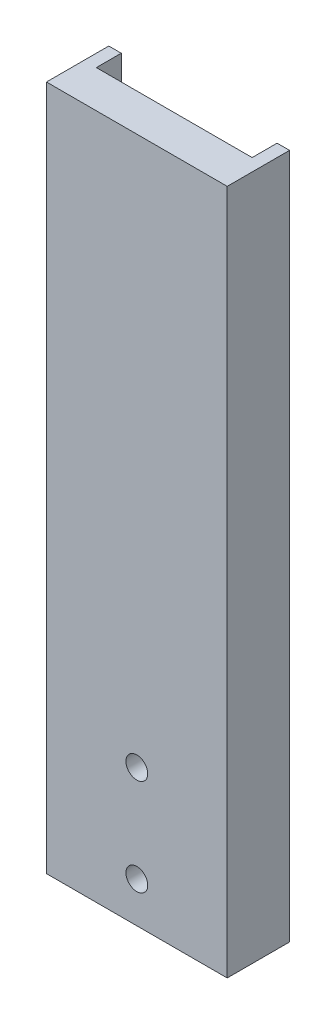
ISO-10303-21;
HEADER;
FILE_DESCRIPTION(('STEP AP214'),'2;1');
FILE_NAME('part.step','',(''),(''),'','','');
FILE_SCHEMA(('AUTOMOTIVE_DESIGN { 1 0 10303 214 1 1 1 1 }'));
ENDSEC;
DATA;
#1=APPLICATION_CONTEXT('core data for automotive mechanical design processes');
#2=APPLICATION_PROTOCOL_DEFINITION('international standard','automotive_design',2000,#1);
#3=PRODUCT_CONTEXT('',#1,'mechanical');
#4=PRODUCT('Part','Part','',(#3));
#5=PRODUCT_RELATED_PRODUCT_CATEGORY('part','',(#4));
#6=PRODUCT_DEFINITION_FORMATION('','',#4);
#7=PRODUCT_DEFINITION_CONTEXT('part definition',#1,'design');
#8=PRODUCT_DEFINITION('design','',#6,#7);
#9=PRODUCT_DEFINITION_SHAPE('','',#8);
#10=(LENGTH_UNIT() NAMED_UNIT(*) SI_UNIT(.MILLI.,.METRE.));
#11=(NAMED_UNIT(*) PLANE_ANGLE_UNIT() SI_UNIT($,.RADIAN.));
#12=(NAMED_UNIT(*) SI_UNIT($,.STERADIAN.) SOLID_ANGLE_UNIT());
#13=UNCERTAINTY_MEASURE_WITH_UNIT(LENGTH_MEASURE(1.E-05),#10,'distance_accuracy_value','');
#14=(GEOMETRIC_REPRESENTATION_CONTEXT(3) GLOBAL_UNCERTAINTY_ASSIGNED_CONTEXT((#13)) GLOBAL_UNIT_ASSIGNED_CONTEXT((#10,
#11,#12)) REPRESENTATION_CONTEXT('',''));
#15=CARTESIAN_POINT('',(0.,0.,0.));
#16=DIRECTION('',(0.,0.,1.));
#17=DIRECTION('',(1.,0.,0.));
#18=AXIS2_PLACEMENT_3D('',#15,#16,#17);
#19=CARTESIAN_POINT('',(0.,-33.,10.));
#20=DIRECTION('',(0.,0.,-1.));
#21=DIRECTION('',(-1.,0.,0.));
#22=AXIS2_PLACEMENT_3D('',#19,#20,#21);
#23=CYLINDRICAL_SURFACE('',#22,1.75);
#24=CARTESIAN_POINT('',(0.,-33.,10.));
#25=DIRECTION('',(0.,0.,-1.));
#26=DIRECTION('',(-1.,0.,0.));
#27=AXIS2_PLACEMENT_3D('',#24,#25,#26);
#28=CIRCLE('',#27,1.75);
#29=CARTESIAN_POINT('',(-1.75,-33.,10.));
#30=VERTEX_POINT('',#29);
#31=EDGE_CURVE('E279',#30,#30,#28,.T.);
#32=ORIENTED_EDGE('',*,*,#31,.F.);
#33=EDGE_LOOP('',(#32));
#34=FACE_BOUND('',#33,.T.);
#35=CARTESIAN_POINT('',(0.,-33.,3.));
#36=DIRECTION('',(0.,0.,-1.));
#37=DIRECTION('',(-1.,0.,0.));
#38=AXIS2_PLACEMENT_3D('',#35,#36,#37);
#39=CIRCLE('',#38,1.75);
#40=CARTESIAN_POINT('',(-1.75,-33.,3.));
#41=VERTEX_POINT('',#40);
#42=EDGE_CURVE('E39',#41,#41,#39,.F.);
#43=ORIENTED_EDGE('',*,*,#42,.F.);
#44=EDGE_LOOP('',(#43));
#45=FACE_BOUND('',#44,.T.);
#46=ADVANCED_FACE('F35',(#34,#45),#23,.F.);
#47=CARTESIAN_POINT('',(0.,-48.5,10.));
#48=DIRECTION('',(0.,0.,-1.));
#49=DIRECTION('',(-1.,0.,0.));
#50=AXIS2_PLACEMENT_3D('',#47,#48,#49);
#51=CYLINDRICAL_SURFACE('',#50,1.75);
#52=CARTESIAN_POINT('',(0.,-48.5,10.));
#53=DIRECTION('',(0.,0.,-1.));
#54=DIRECTION('',(-1.,0.,0.));
#55=AXIS2_PLACEMENT_3D('',#52,#53,#54);
#56=CIRCLE('',#55,1.75);
#57=CARTESIAN_POINT('',(-1.75,-48.5,10.));
#58=VERTEX_POINT('',#57);
#59=EDGE_CURVE('E275',#58,#58,#56,.T.);
#60=ORIENTED_EDGE('',*,*,#59,.F.);
#61=EDGE_LOOP('',(#60));
#62=FACE_BOUND('',#61,.T.);
#63=CARTESIAN_POINT('',(0.,-48.5,3.));
#64=DIRECTION('',(0.,0.,-1.));
#65=DIRECTION('',(-1.,0.,0.));
#66=AXIS2_PLACEMENT_3D('',#63,#64,#65);
#67=CIRCLE('',#66,1.75);
#68=CARTESIAN_POINT('',(-1.75,-48.5,3.));
#69=VERTEX_POINT('',#68);
#70=EDGE_CURVE('E222',#69,#69,#67,.F.);
#71=ORIENTED_EDGE('',*,*,#70,.F.);
#72=EDGE_LOOP('',(#71));
#73=FACE_BOUND('',#72,.T.);
#74=ADVANCED_FACE('F343',(#62,#73),#51,.F.);
#75=CARTESIAN_POINT('',(14.5,55.,10.));
#76=DIRECTION('',(0.,-1.,0.));
#77=DIRECTION('',(0.,0.,-1.));
#78=AXIS2_PLACEMENT_3D('',#75,#76,#77);
#79=PLANE('',#78);
#80=DIRECTION('',(0.,0.,1.));
#81=VECTOR('',#80,1.);
#82=CARTESIAN_POINT('',(-12.5,55.,10.));
#83=LINE('',#82,#81);
#84=CARTESIAN_POINT('',(-12.5,55.,0.));
#85=VERTEX_POINT('',#84);
#86=CARTESIAN_POINT('',(-12.5,55.,4.00000000000001));
#87=VERTEX_POINT('',#86);
#88=EDGE_CURVE('E298',#85,#87,#83,.T.);
#89=ORIENTED_EDGE('',*,*,#88,.F.);
#90=DIRECTION('',(-1.,0.,0.));
#91=VECTOR('',#90,1.);
#92=CARTESIAN_POINT('',(14.5,55.,0.));
#93=LINE('',#92,#91);
#94=CARTESIAN_POINT('',(-14.5,55.,0.));
#95=VERTEX_POINT('',#94);
#96=EDGE_CURVE('E318',#85,#95,#93,.T.);
#97=ORIENTED_EDGE('',*,*,#96,.T.);
#98=DIRECTION('',(0.,0.,-1.));
#99=VECTOR('',#98,1.);
#100=CARTESIAN_POINT('',(-14.5,55.,10.));
#101=LINE('',#100,#99);
#102=CARTESIAN_POINT('',(-14.5,55.,10.));
#103=VERTEX_POINT('',#102);
#104=EDGE_CURVE('E311',#103,#95,#101,.T.);
#105=ORIENTED_EDGE('',*,*,#104,.F.);
#106=DIRECTION('',(-1.,0.,0.));
#107=VECTOR('',#106,1.);
#108=CARTESIAN_POINT('',(14.5,55.,10.));
#109=LINE('',#108,#107);
#110=CARTESIAN_POINT('',(14.5,55.,10.));
#111=VERTEX_POINT('',#110);
#112=EDGE_CURVE('E309',#111,#103,#109,.T.);
#113=ORIENTED_EDGE('',*,*,#112,.F.);
#114=DIRECTION('',(0.,0.,-1.));
#115=VECTOR('',#114,1.);
#116=CARTESIAN_POINT('',(14.5,55.,10.));
#117=LINE('',#116,#115);
#118=CARTESIAN_POINT('',(14.5,55.,0.));
#119=VERTEX_POINT('',#118);
#120=EDGE_CURVE('E323',#111,#119,#117,.T.);
#121=ORIENTED_EDGE('',*,*,#120,.T.);
#122=CARTESIAN_POINT('',(12.5,55.,0.));
#123=VERTEX_POINT('',#122);
#124=EDGE_CURVE('E305',#119,#123,#93,.T.);
#125=ORIENTED_EDGE('',*,*,#124,.T.);
#126=DIRECTION('',(0.,0.,-1.));
#127=VECTOR('',#126,1.);
#128=CARTESIAN_POINT('',(12.5,55.,10.));
#129=LINE('',#128,#127);
#130=CARTESIAN_POINT('',(12.5,55.,4.));
#131=VERTEX_POINT('',#130);
#132=EDGE_CURVE('E296',#131,#123,#129,.T.);
#133=ORIENTED_EDGE('',*,*,#132,.F.);
#134=DIRECTION('',(1.,0.,0.));
#135=VECTOR('',#134,1.);
#136=CARTESIAN_POINT('',(14.5,55.,4.));
#137=LINE('',#136,#135);
#138=EDGE_CURVE('E11',#87,#131,#137,.T.);
#139=ORIENTED_EDGE('',*,*,#138,.F.);
#140=EDGE_LOOP('',(#89,#97,#105,#113,#121,#125,#133,#139));
#141=FACE_BOUND('',#140,.T.);
#142=ADVANCED_FACE('F349',(#141),#79,.F.);
#143=CARTESIAN_POINT('',(0.,0.,0.));
#144=DIRECTION('',(0.,0.,1.));
#145=DIRECTION('',(1.,0.,0.));
#146=AXIS2_PLACEMENT_3D('',#143,#144,#145);
#147=PLANE('',#146);
#148=DIRECTION('',(-0.5,0.866025403784439,0.));
#149=VECTOR('',#148,1.);
#150=CARTESIAN_POINT('',(-1.87638837486628,-51.75,0.));
#151=LINE('',#150,#149);
#152=CARTESIAN_POINT('',(-1.87638837486628,-51.75,0.));
#153=VERTEX_POINT('',#152);
#154=CARTESIAN_POINT('',(-3.75277674973256,-48.5,0.));
#155=VERTEX_POINT('',#154);
#156=EDGE_CURVE('E209',#153,#155,#151,.T.);
#157=ORIENTED_EDGE('',*,*,#156,.F.);
#158=DIRECTION('',(-1.,0.,0.));
#159=VECTOR('',#158,1.);
#160=CARTESIAN_POINT('',(1.87638837486629,-51.75,0.));
#161=LINE('',#160,#159);
#162=CARTESIAN_POINT('',(1.87638837486629,-51.75,0.));
#163=VERTEX_POINT('',#162);
#164=EDGE_CURVE('E52',#163,#153,#161,.T.);
#165=ORIENTED_EDGE('',*,*,#164,.F.);
#166=DIRECTION('',(-0.5,-0.866025403784438,0.));
#167=VECTOR('',#166,1.);
#168=CARTESIAN_POINT('',(3.75277674973258,-48.5,0.));
#169=LINE('',#168,#167);
#170=CARTESIAN_POINT('',(3.75277674973258,-48.5,0.));
#171=VERTEX_POINT('',#170);
#172=EDGE_CURVE('E195',#171,#163,#169,.T.);
#173=ORIENTED_EDGE('',*,*,#172,.F.);
#174=DIRECTION('',(0.5,-0.866025403784439,0.));
#175=VECTOR('',#174,1.);
#176=CARTESIAN_POINT('',(1.8763883748663,-45.25,0.));
#177=LINE('',#176,#175);
#178=CARTESIAN_POINT('',(1.8763883748663,-45.25,0.));
#179=VERTEX_POINT('',#178);
#180=EDGE_CURVE('E198',#179,#171,#177,.T.);
#181=ORIENTED_EDGE('',*,*,#180,.F.);
#182=DIRECTION('',(1.,0.,0.));
#183=VECTOR('',#182,1.);
#184=CARTESIAN_POINT('',(-1.87638837486627,-45.25,0.));
#185=LINE('',#184,#183);
#186=CARTESIAN_POINT('',(-1.87638837486627,-45.25,0.));
#187=VERTEX_POINT('',#186);
#188=EDGE_CURVE('E215',#187,#179,#185,.T.);
#189=ORIENTED_EDGE('',*,*,#188,.F.);
#190=DIRECTION('',(0.5,0.866025403784439,0.));
#191=VECTOR('',#190,1.);
#192=CARTESIAN_POINT('',(-3.75277674973256,-48.5,0.));
#193=LINE('',#192,#191);
#194=EDGE_CURVE('E212',#155,#187,#193,.T.);
#195=ORIENTED_EDGE('',*,*,#194,.F.);
#196=EDGE_LOOP('',(#157,#165,#173,#181,#189,#195));
#197=FACE_BOUND('',#196,.T.);
#198=DIRECTION('',(-0.5,0.866025403784439,0.));
#199=VECTOR('',#198,1.);
#200=CARTESIAN_POINT('',(-1.87638837486628,-36.25,0.));
#201=LINE('',#200,#199);
#202=CARTESIAN_POINT('',(-1.87638837486628,-36.25,0.));
#203=VERTEX_POINT('',#202);
#204=CARTESIAN_POINT('',(-3.75277674973256,-33.,0.));
#205=VERTEX_POINT('',#204);
#206=EDGE_CURVE('E251',#203,#205,#201,.T.);
#207=ORIENTED_EDGE('',*,*,#206,.F.);
#208=DIRECTION('',(-1.,0.,0.));
#209=VECTOR('',#208,1.);
#210=CARTESIAN_POINT('',(1.87638837486628,-36.25,0.));
#211=LINE('',#210,#209);
#212=CARTESIAN_POINT('',(1.87638837486628,-36.25,0.));
#213=VERTEX_POINT('',#212);
#214=EDGE_CURVE('E60',#213,#203,#211,.T.);
#215=ORIENTED_EDGE('',*,*,#214,.F.);
#216=DIRECTION('',(-0.5,-0.866025403784438,0.));
#217=VECTOR('',#216,1.);
#218=CARTESIAN_POINT('',(3.75277674973257,-33.,0.));
#219=LINE('',#218,#217);
#220=CARTESIAN_POINT('',(3.75277674973257,-33.,0.));
#221=VERTEX_POINT('',#220);
#222=EDGE_CURVE('E234',#221,#213,#219,.T.);
#223=ORIENTED_EDGE('',*,*,#222,.F.);
#224=DIRECTION('',(0.5,-0.866025403784439,0.));
#225=VECTOR('',#224,1.);
#226=CARTESIAN_POINT('',(1.87638837486629,-29.75,0.));
#227=LINE('',#226,#225);
#228=CARTESIAN_POINT('',(1.87638837486629,-29.75,0.));
#229=VERTEX_POINT('',#228);
#230=EDGE_CURVE('E260',#229,#221,#227,.T.);
#231=ORIENTED_EDGE('',*,*,#230,.F.);
#232=DIRECTION('',(1.,0.,0.));
#233=VECTOR('',#232,1.);
#234=CARTESIAN_POINT('',(-1.87638837486628,-29.75,0.));
#235=LINE('',#234,#233);
#236=CARTESIAN_POINT('',(-1.87638837486628,-29.75,0.));
#237=VERTEX_POINT('',#236);
#238=EDGE_CURVE('E257',#237,#229,#235,.T.);
#239=ORIENTED_EDGE('',*,*,#238,.F.);
#240=DIRECTION('',(0.500000000000001,0.866025403784438,0.));
#241=VECTOR('',#240,1.);
#242=CARTESIAN_POINT('',(-3.75277674973256,-33.,0.));
#243=LINE('',#242,#241);
#244=EDGE_CURVE('E254',#205,#237,#243,.T.);
#245=ORIENTED_EDGE('',*,*,#244,.F.);
#246=EDGE_LOOP('',(#207,#215,#223,#231,#239,#245));
#247=FACE_BOUND('',#246,.T.);
#248=DIRECTION('',(0.,1.,0.));
#249=VECTOR('',#248,1.);
#250=CARTESIAN_POINT('',(-12.5,0.,0.));
#251=LINE('',#250,#249);
#252=CARTESIAN_POINT('',(-12.5,5.,0.));
#253=VERTEX_POINT('',#252);
#254=EDGE_CURVE('E44',#253,#85,#251,.T.);
#255=ORIENTED_EDGE('',*,*,#254,.F.);
#256=DIRECTION('',(-1.,0.,0.));
#257=VECTOR('',#256,1.);
#258=CARTESIAN_POINT('',(-12.5,5.,0.));
#259=LINE('',#258,#257);
#260=CARTESIAN_POINT('',(12.5,5.,0.));
#261=VERTEX_POINT('',#260);
#262=EDGE_CURVE('E278',#261,#253,#259,.T.);
#263=ORIENTED_EDGE('',*,*,#262,.F.);
#264=DIRECTION('',(0.,-1.,0.));
#265=VECTOR('',#264,1.);
#266=CARTESIAN_POINT('',(12.5,0.,0.));
#267=LINE('',#266,#265);
#268=EDGE_CURVE('E332',#123,#261,#267,.T.);
#269=ORIENTED_EDGE('',*,*,#268,.F.);
#270=ORIENTED_EDGE('',*,*,#124,.F.);
#271=DIRECTION('',(0.,1.,0.));
#272=VECTOR('',#271,1.);
#273=CARTESIAN_POINT('',(14.5,-55.,0.));
#274=LINE('',#273,#272);
#275=CARTESIAN_POINT('',(14.5,-55.,0.));
#276=VERTEX_POINT('',#275);
#277=EDGE_CURVE('E316',#276,#119,#274,.T.);
#278=ORIENTED_EDGE('',*,*,#277,.F.);
#279=DIRECTION('',(1.,0.,0.));
#280=VECTOR('',#279,1.);
#281=CARTESIAN_POINT('',(14.5,-55.,0.));
#282=LINE('',#281,#280);
#283=CARTESIAN_POINT('',(-14.5,-55.,0.));
#284=VERTEX_POINT('',#283);
#285=EDGE_CURVE('E314',#284,#276,#282,.T.);
#286=ORIENTED_EDGE('',*,*,#285,.F.);
#287=DIRECTION('',(0.,-1.,0.));
#288=VECTOR('',#287,1.);
#289=CARTESIAN_POINT('',(-14.5,-55.,0.));
#290=LINE('',#289,#288);
#291=EDGE_CURVE('E300',#95,#284,#290,.T.);
#292=ORIENTED_EDGE('',*,*,#291,.F.);
#293=ORIENTED_EDGE('',*,*,#96,.F.);
#294=EDGE_LOOP('',(#255,#263,#269,#270,#278,#286,#292,#293));
#295=FACE_BOUND('',#294,.T.);
#296=ADVANCED_FACE('F376',(#197,#247,#295),#147,.F.);
#297=CARTESIAN_POINT('',(-14.5,-55.,10.));
#298=DIRECTION('',(1.,0.,0.));
#299=DIRECTION('',(0.,0.,-1.));
#300=AXIS2_PLACEMENT_3D('',#297,#298,#299);
#301=PLANE('',#300);
#302=ORIENTED_EDGE('',*,*,#291,.T.);
#303=DIRECTION('',(0.,0.,-1.));
#304=VECTOR('',#303,1.);
#305=CARTESIAN_POINT('',(-14.5,-55.,10.));
#306=LINE('',#305,#304);
#307=CARTESIAN_POINT('',(-14.5,-55.,10.));
#308=VERTEX_POINT('',#307);
#309=EDGE_CURVE('E329',#308,#284,#306,.T.);
#310=ORIENTED_EDGE('',*,*,#309,.F.);
#311=DIRECTION('',(0.,-1.,0.));
#312=VECTOR('',#311,1.);
#313=CARTESIAN_POINT('',(-14.5,-55.,10.));
#314=LINE('',#313,#312);
#315=EDGE_CURVE('E301',#103,#308,#314,.T.);
#316=ORIENTED_EDGE('',*,*,#315,.F.);
#317=ORIENTED_EDGE('',*,*,#104,.T.);
#318=EDGE_LOOP('',(#302,#310,#316,#317));
#319=FACE_BOUND('',#318,.T.);
#320=ADVANCED_FACE('F37',(#319),#301,.F.);
#321=CARTESIAN_POINT('',(14.5,-55.,10.));
#322=DIRECTION('',(0.,1.,0.));
#323=DIRECTION('',(-1.,0.,0.));
#324=AXIS2_PLACEMENT_3D('',#321,#322,#323);
#325=PLANE('',#324);
#326=ORIENTED_EDGE('',*,*,#285,.T.);
#327=DIRECTION('',(0.,0.,-1.));
#328=VECTOR('',#327,1.);
#329=CARTESIAN_POINT('',(14.5,-55.,10.));
#330=LINE('',#329,#328);
#331=CARTESIAN_POINT('',(14.5,-55.,10.));
#332=VERTEX_POINT('',#331);
#333=EDGE_CURVE('E326',#332,#276,#330,.T.);
#334=ORIENTED_EDGE('',*,*,#333,.F.);
#335=DIRECTION('',(1.,0.,0.));
#336=VECTOR('',#335,1.);
#337=CARTESIAN_POINT('',(14.5,-55.,10.));
#338=LINE('',#337,#336);
#339=EDGE_CURVE('E304',#308,#332,#338,.T.);
#340=ORIENTED_EDGE('',*,*,#339,.F.);
#341=ORIENTED_EDGE('',*,*,#309,.T.);
#342=EDGE_LOOP('',(#326,#334,#340,#341));
#343=FACE_BOUND('',#342,.T.);
#344=ADVANCED_FACE('F384',(#343),#325,.F.);
#345=CARTESIAN_POINT('',(14.5,-55.,10.));
#346=DIRECTION('',(-1.,0.,0.));
#347=DIRECTION('',(0.,0.,1.));
#348=AXIS2_PLACEMENT_3D('',#345,#346,#347);
#349=PLANE('',#348);
#350=ORIENTED_EDGE('',*,*,#277,.T.);
#351=ORIENTED_EDGE('',*,*,#120,.F.);
#352=DIRECTION('',(0.,1.,0.));
#353=VECTOR('',#352,1.);
#354=CARTESIAN_POINT('',(14.5,-55.,10.));
#355=LINE('',#354,#353);
#356=EDGE_CURVE('E307',#332,#111,#355,.T.);
#357=ORIENTED_EDGE('',*,*,#356,.F.);
#358=ORIENTED_EDGE('',*,*,#333,.T.);
#359=EDGE_LOOP('',(#350,#351,#357,#358));
#360=FACE_BOUND('',#359,.T.);
#361=ADVANCED_FACE('F374',(#360),#349,.F.);
#362=CARTESIAN_POINT('',(0.,0.,10.));
#363=DIRECTION('',(0.,0.,1.));
#364=DIRECTION('',(1.,0.,0.));
#365=AXIS2_PLACEMENT_3D('',#362,#363,#364);
#366=PLANE('',#365);
#367=ORIENTED_EDGE('',*,*,#59,.T.);
#368=EDGE_LOOP('',(#367));
#369=FACE_BOUND('',#368,.T.);
#370=ORIENTED_EDGE('',*,*,#31,.T.);
#371=EDGE_LOOP('',(#370));
#372=FACE_BOUND('',#371,.T.);
#373=ORIENTED_EDGE('',*,*,#315,.T.);
#374=ORIENTED_EDGE('',*,*,#339,.T.);
#375=ORIENTED_EDGE('',*,*,#356,.T.);
#376=ORIENTED_EDGE('',*,*,#112,.T.);
#377=EDGE_LOOP('',(#373,#374,#375,#376));
#378=FACE_BOUND('',#377,.T.);
#379=ADVANCED_FACE('F367',(#369,#372,#378),#366,.T.);
#380=CARTESIAN_POINT('',(-12.5,55.000012,4.00000000000001));
#381=DIRECTION('',(0.,0.,-1.));
#382=DIRECTION('',(-1.,0.,0.));
#383=AXIS2_PLACEMENT_3D('',#380,#381,#382);
#384=PLANE('',#383);
#385=ORIENTED_EDGE('',*,*,#138,.T.);
#386=DIRECTION('',(0.,-1.,0.));
#387=VECTOR('',#386,1.);
#388=CARTESIAN_POINT('',(12.5,55.000012,4.));
#389=LINE('',#388,#387);
#390=CARTESIAN_POINT('',(12.5,5.,4.));
#391=VERTEX_POINT('',#390);
#392=EDGE_CURVE('E292',#131,#391,#389,.T.);
#393=ORIENTED_EDGE('',*,*,#392,.T.);
#394=DIRECTION('',(1.,0.,0.));
#395=VECTOR('',#394,1.);
#396=CARTESIAN_POINT('',(-12.5,5.,4.00000000000001));
#397=LINE('',#396,#395);
#398=CARTESIAN_POINT('',(-12.5,5.,4.00000000000001));
#399=VERTEX_POINT('',#398);
#400=EDGE_CURVE('E287',#399,#391,#397,.T.);
#401=ORIENTED_EDGE('',*,*,#400,.F.);
#402=DIRECTION('',(0.,-1.,0.));
#403=VECTOR('',#402,1.);
#404=CARTESIAN_POINT('',(-12.5,55.000012,4.00000000000001));
#405=LINE('',#404,#403);
#406=EDGE_CURVE('E294',#87,#399,#405,.T.);
#407=ORIENTED_EDGE('',*,*,#406,.F.);
#408=EDGE_LOOP('',(#385,#393,#401,#407));
#409=FACE_BOUND('',#408,.T.);
#410=ADVANCED_FACE('F364',(#409),#384,.T.);
#411=CARTESIAN_POINT('',(-12.5,55.000012,0.));
#412=DIRECTION('',(1.,0.,0.));
#413=DIRECTION('',(0.,0.,-1.));
#414=AXIS2_PLACEMENT_3D('',#411,#412,#413);
#415=PLANE('',#414);
#416=ORIENTED_EDGE('',*,*,#88,.T.);
#417=ORIENTED_EDGE('',*,*,#406,.T.);
#418=DIRECTION('',(0.,0.,1.));
#419=VECTOR('',#418,1.);
#420=CARTESIAN_POINT('',(-12.5,5.,0.));
#421=LINE('',#420,#419);
#422=EDGE_CURVE('E284',#253,#399,#421,.T.);
#423=ORIENTED_EDGE('',*,*,#422,.F.);
#424=ORIENTED_EDGE('',*,*,#254,.T.);
#425=EDGE_LOOP('',(#416,#417,#423,#424));
#426=FACE_BOUND('',#425,.T.);
#427=ADVANCED_FACE('F362',(#426),#415,.T.);
#428=CARTESIAN_POINT('',(12.5,55.000012,4.));
#429=DIRECTION('',(-1.,0.,0.));
#430=DIRECTION('',(0.,0.,1.));
#431=AXIS2_PLACEMENT_3D('',#428,#429,#430);
#432=PLANE('',#431);
#433=ORIENTED_EDGE('',*,*,#132,.T.);
#434=ORIENTED_EDGE('',*,*,#268,.T.);
#435=DIRECTION('',(0.,0.,-1.));
#436=VECTOR('',#435,1.);
#437=CARTESIAN_POINT('',(12.5,5.,4.));
#438=LINE('',#437,#436);
#439=EDGE_CURVE('E290',#391,#261,#438,.T.);
#440=ORIENTED_EDGE('',*,*,#439,.F.);
#441=ORIENTED_EDGE('',*,*,#392,.F.);
#442=EDGE_LOOP('',(#433,#434,#440,#441));
#443=FACE_BOUND('',#442,.T.);
#444=ADVANCED_FACE('F358',(#443),#432,.T.);
#445=CARTESIAN_POINT('',(0.,5.,0.));
#446=DIRECTION('',(0.,1.,0.));
#447=DIRECTION('',(0.,0.,1.));
#448=AXIS2_PLACEMENT_3D('',#445,#446,#447);
#449=PLANE('',#448);
#450=ORIENTED_EDGE('',*,*,#262,.T.);
#451=ORIENTED_EDGE('',*,*,#422,.T.);
#452=ORIENTED_EDGE('',*,*,#400,.T.);
#453=ORIENTED_EDGE('',*,*,#439,.T.);
#454=EDGE_LOOP('',(#450,#451,#452,#453));
#455=FACE_BOUND('',#454,.T.);
#456=ADVANCED_FACE('F355',(#455),#449,.T.);
#457=CARTESIAN_POINT('',(0.,0.,3.));
#458=DIRECTION('',(0.,0.,-1.));
#459=DIRECTION('',(-1.,0.,0.));
#460=AXIS2_PLACEMENT_3D('',#457,#458,#459);
#461=PLANE('',#460);
#462=DIRECTION('',(-1.,0.,0.));
#463=VECTOR('',#462,1.);
#464=CARTESIAN_POINT('',(1.87638837486629,-51.75,3.));
#465=LINE('',#464,#463);
#466=CARTESIAN_POINT('',(1.87638837486629,-51.75,3.));
#467=VERTEX_POINT('',#466);
#468=CARTESIAN_POINT('',(-1.87638837486628,-51.75,3.));
#469=VERTEX_POINT('',#468);
#470=EDGE_CURVE('E175',#467,#469,#465,.T.);
#471=ORIENTED_EDGE('',*,*,#470,.T.);
#472=DIRECTION('',(-0.5,0.866025403784439,0.));
#473=VECTOR('',#472,1.);
#474=CARTESIAN_POINT('',(-1.87638837486628,-51.75,3.));
#475=LINE('',#474,#473);
#476=CARTESIAN_POINT('',(-3.75277674973256,-48.5,3.));
#477=VERTEX_POINT('',#476);
#478=EDGE_CURVE('E184',#469,#477,#475,.T.);
#479=ORIENTED_EDGE('',*,*,#478,.T.);
#480=DIRECTION('',(0.5,0.866025403784439,0.));
#481=VECTOR('',#480,1.);
#482=CARTESIAN_POINT('',(-3.75277674973256,-48.5,3.));
#483=LINE('',#482,#481);
#484=CARTESIAN_POINT('',(-1.87638837486627,-45.25,3.));
#485=VERTEX_POINT('',#484);
#486=EDGE_CURVE('E189',#477,#485,#483,.T.);
#487=ORIENTED_EDGE('',*,*,#486,.T.);
#488=DIRECTION('',(1.,0.,0.));
#489=VECTOR('',#488,1.);
#490=CARTESIAN_POINT('',(-1.87638837486627,-45.25,3.));
#491=LINE('',#490,#489);
#492=CARTESIAN_POINT('',(1.8763883748663,-45.25,3.));
#493=VERTEX_POINT('',#492);
#494=EDGE_CURVE('E202',#485,#493,#491,.T.);
#495=ORIENTED_EDGE('',*,*,#494,.T.);
#496=DIRECTION('',(0.5,-0.866025403784439,0.));
#497=VECTOR('',#496,1.);
#498=CARTESIAN_POINT('',(1.8763883748663,-45.25,3.));
#499=LINE('',#498,#497);
#500=CARTESIAN_POINT('',(3.75277674973258,-48.5,3.));
#501=VERTEX_POINT('',#500);
#502=EDGE_CURVE('E205',#493,#501,#499,.T.);
#503=ORIENTED_EDGE('',*,*,#502,.T.);
#504=DIRECTION('',(-0.5,-0.866025403784438,0.));
#505=VECTOR('',#504,1.);
#506=CARTESIAN_POINT('',(3.75277674973258,-48.5,3.));
#507=LINE('',#506,#505);
#508=EDGE_CURVE('E181',#501,#467,#507,.T.);
#509=ORIENTED_EDGE('',*,*,#508,.T.);
#510=EDGE_LOOP('',(#471,#479,#487,#495,#503,#509));
#511=FACE_BOUND('',#510,.T.);
#512=ORIENTED_EDGE('',*,*,#70,.T.);
#513=EDGE_LOOP('',(#512));
#514=FACE_BOUND('',#513,.T.);
#515=ADVANCED_FACE('F191',(#511,#514),#461,.T.);
#516=CARTESIAN_POINT('',(1.87638837486629,-51.75,3.));
#517=DIRECTION('',(0.,-1.,0.));
#518=DIRECTION('',(0.,0.,-1.));
#519=AXIS2_PLACEMENT_3D('',#516,#517,#518);
#520=PLANE('',#519);
#521=ORIENTED_EDGE('',*,*,#164,.T.);
#522=DIRECTION('',(0.,0.,-1.));
#523=VECTOR('',#522,1.);
#524=CARTESIAN_POINT('',(-1.87638837486628,-51.75,3.));
#525=LINE('',#524,#523);
#526=EDGE_CURVE('E171',#469,#153,#525,.T.);
#527=ORIENTED_EDGE('',*,*,#526,.F.);
#528=ORIENTED_EDGE('',*,*,#470,.F.);
#529=DIRECTION('',(0.,0.,-1.));
#530=VECTOR('',#529,1.);
#531=CARTESIAN_POINT('',(1.87638837486629,-51.75,3.));
#532=LINE('',#531,#530);
#533=EDGE_CURVE('E220',#467,#163,#532,.T.);
#534=ORIENTED_EDGE('',*,*,#533,.T.);
#535=EDGE_LOOP('',(#521,#527,#528,#534));
#536=FACE_BOUND('',#535,.T.);
#537=ADVANCED_FACE('F173',(#536),#520,.F.);
#538=CARTESIAN_POINT('',(3.75277674973258,-48.5,3.));
#539=DIRECTION('',(0.866025403784438,-0.500000000000001,0.));
#540=DIRECTION('',(0.500000000000001,0.866025403784438,0.));
#541=AXIS2_PLACEMENT_3D('',#538,#539,#540);
#542=PLANE('',#541);
#543=ORIENTED_EDGE('',*,*,#172,.T.);
#544=ORIENTED_EDGE('',*,*,#533,.F.);
#545=ORIENTED_EDGE('',*,*,#508,.F.);
#546=DIRECTION('',(0.,0.,-1.));
#547=VECTOR('',#546,1.);
#548=CARTESIAN_POINT('',(3.75277674973258,-48.5,3.));
#549=LINE('',#548,#547);
#550=EDGE_CURVE('E223',#501,#171,#549,.T.);
#551=ORIENTED_EDGE('',*,*,#550,.T.);
#552=EDGE_LOOP('',(#543,#544,#545,#551));
#553=FACE_BOUND('',#552,.T.);
#554=ADVANCED_FACE('F483',(#553),#542,.F.);
#555=CARTESIAN_POINT('',(1.8763883748663,-45.25,3.));
#556=DIRECTION('',(0.866025403784439,0.5,0.));
#557=DIRECTION('',(-0.5,0.866025403784439,0.));
#558=AXIS2_PLACEMENT_3D('',#555,#556,#557);
#559=PLANE('',#558);
#560=ORIENTED_EDGE('',*,*,#180,.T.);
#561=ORIENTED_EDGE('',*,*,#550,.F.);
#562=ORIENTED_EDGE('',*,*,#502,.F.);
#563=DIRECTION('',(0.,0.,-1.));
#564=VECTOR('',#563,1.);
#565=CARTESIAN_POINT('',(1.8763883748663,-45.25,3.));
#566=LINE('',#565,#564);
#567=EDGE_CURVE('E225',#493,#179,#566,.T.);
#568=ORIENTED_EDGE('',*,*,#567,.T.);
#569=EDGE_LOOP('',(#560,#561,#562,#568));
#570=FACE_BOUND('',#569,.T.);
#571=ADVANCED_FACE('F490',(#570),#559,.F.);
#572=CARTESIAN_POINT('',(-1.87638837486627,-45.25,3.));
#573=DIRECTION('',(0.,1.,0.));
#574=DIRECTION('',(0.,0.,1.));
#575=AXIS2_PLACEMENT_3D('',#572,#573,#574);
#576=PLANE('',#575);
#577=ORIENTED_EDGE('',*,*,#188,.T.);
#578=ORIENTED_EDGE('',*,*,#567,.F.);
#579=ORIENTED_EDGE('',*,*,#494,.F.);
#580=DIRECTION('',(0.,0.,-1.));
#581=VECTOR('',#580,1.);
#582=CARTESIAN_POINT('',(-1.87638837486627,-45.25,3.));
#583=LINE('',#582,#581);
#584=EDGE_CURVE('E227',#485,#187,#583,.T.);
#585=ORIENTED_EDGE('',*,*,#584,.T.);
#586=EDGE_LOOP('',(#577,#578,#579,#585));
#587=FACE_BOUND('',#586,.T.);
#588=ADVANCED_FACE('F498',(#587),#576,.F.);
#589=CARTESIAN_POINT('',(-3.75277674973256,-48.5,3.));
#590=DIRECTION('',(-0.866025403784439,0.5,0.));
#591=DIRECTION('',(-0.5,-0.866025403784439,0.));
#592=AXIS2_PLACEMENT_3D('',#589,#590,#591);
#593=PLANE('',#592);
#594=ORIENTED_EDGE('',*,*,#194,.T.);
#595=ORIENTED_EDGE('',*,*,#584,.F.);
#596=ORIENTED_EDGE('',*,*,#486,.F.);
#597=DIRECTION('',(0.,0.,-1.));
#598=VECTOR('',#597,1.);
#599=CARTESIAN_POINT('',(-3.75277674973256,-48.5,3.));
#600=LINE('',#599,#598);
#601=EDGE_CURVE('E180',#477,#155,#600,.T.);
#602=ORIENTED_EDGE('',*,*,#601,.T.);
#603=EDGE_LOOP('',(#594,#595,#596,#602));
#604=FACE_BOUND('',#603,.T.);
#605=ADVANCED_FACE('F506',(#604),#593,.F.);
#606=CARTESIAN_POINT('',(-1.87638837486628,-51.75,3.));
#607=DIRECTION('',(-0.866025403784438,-0.5,0.));
#608=DIRECTION('',(0.5,-0.866025403784439,0.));
#609=AXIS2_PLACEMENT_3D('',#606,#607,#608);
#610=PLANE('',#609);
#611=ORIENTED_EDGE('',*,*,#156,.T.);
#612=ORIENTED_EDGE('',*,*,#601,.F.);
#613=ORIENTED_EDGE('',*,*,#478,.F.);
#614=ORIENTED_EDGE('',*,*,#526,.T.);
#615=EDGE_LOOP('',(#611,#612,#613,#614));
#616=FACE_BOUND('',#615,.T.);
#617=ADVANCED_FACE('F185',(#616),#610,.F.);
#618=CARTESIAN_POINT('',(0.,0.,3.));
#619=DIRECTION('',(0.,0.,-1.));
#620=DIRECTION('',(-1.,0.,0.));
#621=AXIS2_PLACEMENT_3D('',#618,#619,#620);
#622=PLANE('',#621);
#623=DIRECTION('',(-1.,0.,0.));
#624=VECTOR('',#623,1.);
#625=CARTESIAN_POINT('',(1.87638837486628,-36.25,3.));
#626=LINE('',#625,#624);
#627=CARTESIAN_POINT('',(1.87638837486628,-36.25,3.));
#628=VERTEX_POINT('',#627);
#629=CARTESIAN_POINT('',(-1.87638837486628,-36.25,3.));
#630=VERTEX_POINT('',#629);
#631=EDGE_CURVE('E230',#628,#630,#626,.T.);
#632=ORIENTED_EDGE('',*,*,#631,.T.);
#633=DIRECTION('',(-0.5,0.866025403784439,0.));
#634=VECTOR('',#633,1.);
#635=CARTESIAN_POINT('',(-1.87638837486628,-36.25,3.));
#636=LINE('',#635,#634);
#637=CARTESIAN_POINT('',(-3.75277674973256,-33.,3.));
#638=VERTEX_POINT('',#637);
#639=EDGE_CURVE('E233',#630,#638,#636,.T.);
#640=ORIENTED_EDGE('',*,*,#639,.T.);
#641=DIRECTION('',(0.500000000000001,0.866025403784438,0.));
#642=VECTOR('',#641,1.);
#643=CARTESIAN_POINT('',(-3.75277674973256,-33.,3.));
#644=LINE('',#643,#642);
#645=CARTESIAN_POINT('',(-1.87638837486628,-29.75,3.));
#646=VERTEX_POINT('',#645);
#647=EDGE_CURVE('E237',#638,#646,#644,.T.);
#648=ORIENTED_EDGE('',*,*,#647,.T.);
#649=DIRECTION('',(1.,0.,0.));
#650=VECTOR('',#649,1.);
#651=CARTESIAN_POINT('',(-1.87638837486628,-29.75,3.));
#652=LINE('',#651,#650);
#653=CARTESIAN_POINT('',(1.87638837486629,-29.75,3.));
#654=VERTEX_POINT('',#653);
#655=EDGE_CURVE('E240',#646,#654,#652,.T.);
#656=ORIENTED_EDGE('',*,*,#655,.T.);
#657=DIRECTION('',(0.5,-0.866025403784439,0.));
#658=VECTOR('',#657,1.);
#659=CARTESIAN_POINT('',(1.87638837486629,-29.75,3.));
#660=LINE('',#659,#658);
#661=CARTESIAN_POINT('',(3.75277674973257,-33.,3.));
#662=VERTEX_POINT('',#661);
#663=EDGE_CURVE('E243',#654,#662,#660,.T.);
#664=ORIENTED_EDGE('',*,*,#663,.T.);
#665=DIRECTION('',(-0.5,-0.866025403784438,0.));
#666=VECTOR('',#665,1.);
#667=CARTESIAN_POINT('',(3.75277674973257,-33.,3.));
#668=LINE('',#667,#666);
#669=EDGE_CURVE('E246',#662,#628,#668,.T.);
#670=ORIENTED_EDGE('',*,*,#669,.T.);
#671=EDGE_LOOP('',(#632,#640,#648,#656,#664,#670));
#672=FACE_BOUND('',#671,.T.);
#673=ORIENTED_EDGE('',*,*,#42,.T.);
#674=EDGE_LOOP('',(#673));
#675=FACE_BOUND('',#674,.T.);
#676=ADVANCED_FACE('F340',(#672,#675),#622,.T.);
#677=CARTESIAN_POINT('',(1.87638837486628,-36.25,3.));
#678=DIRECTION('',(0.,-1.,0.));
#679=DIRECTION('',(0.,0.,-1.));
#680=AXIS2_PLACEMENT_3D('',#677,#678,#679);
#681=PLANE('',#680);
#682=ORIENTED_EDGE('',*,*,#214,.T.);
#683=DIRECTION('',(0.,0.,-1.));
#684=VECTOR('',#683,1.);
#685=CARTESIAN_POINT('',(-1.87638837486628,-36.25,3.));
#686=LINE('',#685,#684);
#687=EDGE_CURVE('E249',#630,#203,#686,.T.);
#688=ORIENTED_EDGE('',*,*,#687,.F.);
#689=ORIENTED_EDGE('',*,*,#631,.F.);
#690=DIRECTION('',(0.,0.,-1.));
#691=VECTOR('',#690,1.);
#692=CARTESIAN_POINT('',(1.87638837486628,-36.25,3.));
#693=LINE('',#692,#691);
#694=EDGE_CURVE('E210',#628,#213,#693,.T.);
#695=ORIENTED_EDGE('',*,*,#694,.T.);
#696=EDGE_LOOP('',(#682,#688,#689,#695));
#697=FACE_BOUND('',#696,.T.);
#698=ADVANCED_FACE('F527',(#697),#681,.F.);
#699=CARTESIAN_POINT('',(3.75277674973257,-33.,3.));
#700=DIRECTION('',(0.866025403784438,-0.5,0.));
#701=DIRECTION('',(0.5,0.866025403784438,0.));
#702=AXIS2_PLACEMENT_3D('',#699,#700,#701);
#703=PLANE('',#702);
#704=ORIENTED_EDGE('',*,*,#222,.T.);
#705=ORIENTED_EDGE('',*,*,#694,.F.);
#706=ORIENTED_EDGE('',*,*,#669,.F.);
#707=DIRECTION('',(0.,0.,-1.));
#708=VECTOR('',#707,1.);
#709=CARTESIAN_POINT('',(3.75277674973257,-33.,3.));
#710=LINE('',#709,#708);
#711=EDGE_CURVE('E266',#662,#221,#710,.T.);
#712=ORIENTED_EDGE('',*,*,#711,.T.);
#713=EDGE_LOOP('',(#704,#705,#706,#712));
#714=FACE_BOUND('',#713,.T.);
#715=ADVANCED_FACE('F535',(#714),#703,.F.);
#716=CARTESIAN_POINT('',(1.87638837486629,-29.75,3.));
#717=DIRECTION('',(0.866025403784439,0.5,0.));
#718=DIRECTION('',(-0.5,0.866025403784439,0.));
#719=AXIS2_PLACEMENT_3D('',#716,#717,#718);
#720=PLANE('',#719);
#721=ORIENTED_EDGE('',*,*,#230,.T.);
#722=ORIENTED_EDGE('',*,*,#711,.F.);
#723=ORIENTED_EDGE('',*,*,#663,.F.);
#724=DIRECTION('',(0.,0.,-1.));
#725=VECTOR('',#724,1.);
#726=CARTESIAN_POINT('',(1.87638837486629,-29.75,3.));
#727=LINE('',#726,#725);
#728=EDGE_CURVE('E268',#654,#229,#727,.T.);
#729=ORIENTED_EDGE('',*,*,#728,.T.);
#730=EDGE_LOOP('',(#721,#722,#723,#729));
#731=FACE_BOUND('',#730,.T.);
#732=ADVANCED_FACE('F541',(#731),#720,.F.);
#733=CARTESIAN_POINT('',(-1.87638837486628,-29.75,3.));
#734=DIRECTION('',(0.,1.,0.));
#735=DIRECTION('',(0.,0.,1.));
#736=AXIS2_PLACEMENT_3D('',#733,#734,#735);
#737=PLANE('',#736);
#738=ORIENTED_EDGE('',*,*,#238,.T.);
#739=ORIENTED_EDGE('',*,*,#728,.F.);
#740=ORIENTED_EDGE('',*,*,#655,.F.);
#741=DIRECTION('',(0.,0.,-1.));
#742=VECTOR('',#741,1.);
#743=CARTESIAN_POINT('',(-1.87638837486628,-29.75,3.));
#744=LINE('',#743,#742);
#745=EDGE_CURVE('E270',#646,#237,#744,.T.);
#746=ORIENTED_EDGE('',*,*,#745,.T.);
#747=EDGE_LOOP('',(#738,#739,#740,#746));
#748=FACE_BOUND('',#747,.T.);
#749=ADVANCED_FACE('F549',(#748),#737,.F.);
#750=CARTESIAN_POINT('',(-3.75277674973256,-33.,3.));
#751=DIRECTION('',(-0.866025403784438,0.500000000000001,0.));
#752=DIRECTION('',(-0.500000000000001,-0.866025403784438,0.));
#753=AXIS2_PLACEMENT_3D('',#750,#751,#752);
#754=PLANE('',#753);
#755=ORIENTED_EDGE('',*,*,#244,.T.);
#756=ORIENTED_EDGE('',*,*,#745,.F.);
#757=ORIENTED_EDGE('',*,*,#647,.F.);
#758=DIRECTION('',(0.,0.,-1.));
#759=VECTOR('',#758,1.);
#760=CARTESIAN_POINT('',(-3.75277674973256,-33.,3.));
#761=LINE('',#760,#759);
#762=EDGE_CURVE('E272',#638,#205,#761,.T.);
#763=ORIENTED_EDGE('',*,*,#762,.T.);
#764=EDGE_LOOP('',(#755,#756,#757,#763));
#765=FACE_BOUND('',#764,.T.);
#766=ADVANCED_FACE('F557',(#765),#754,.F.);
#767=CARTESIAN_POINT('',(-1.87638837486628,-36.25,3.));
#768=DIRECTION('',(-0.866025403784439,-0.5,0.));
#769=DIRECTION('',(0.5,-0.866025403784439,0.));
#770=AXIS2_PLACEMENT_3D('',#767,#768,#769);
#771=PLANE('',#770);
#772=ORIENTED_EDGE('',*,*,#206,.T.);
#773=ORIENTED_EDGE('',*,*,#762,.F.);
#774=ORIENTED_EDGE('',*,*,#639,.F.);
#775=ORIENTED_EDGE('',*,*,#687,.T.);
#776=EDGE_LOOP('',(#772,#773,#774,#775));
#777=FACE_BOUND('',#776,.T.);
#778=ADVANCED_FACE('F565',(#777),#771,.F.);
#779=CLOSED_SHELL('',(#46,#74,#142,#296,#320,#344,#361,#379,#410,#427,#444,#456,#515,#537,#554,
#571,#588,#605,#617,#676,#698,#715,#732,#749,#766,#778));
#780=MANIFOLD_SOLID_BREP('B2',#779);
#781=ADVANCED_BREP_SHAPE_REPRESENTATION('',(#18,#780),#14);
#782=SHAPE_DEFINITION_REPRESENTATION(#9,#781);
ENDSEC;
END-ISO-10303-21;
